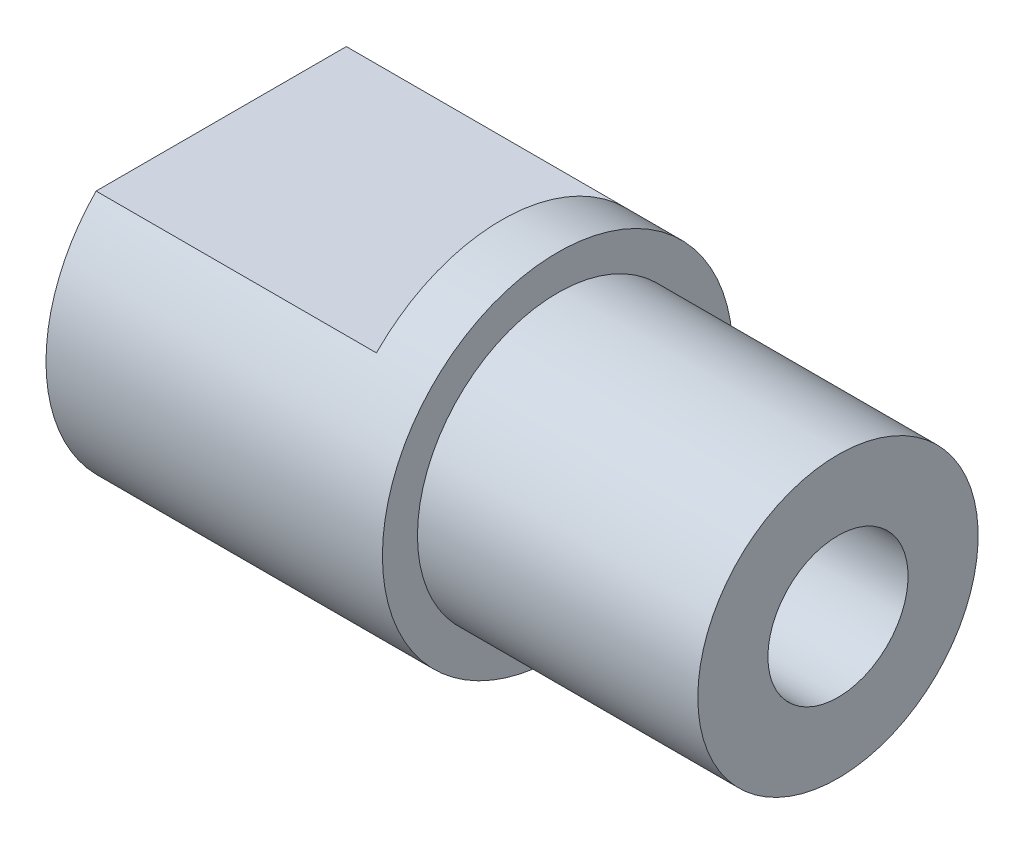
ISO-10303-21;
HEADER;
FILE_DESCRIPTION(('STEP AP214'),'2;1');
FILE_NAME('part.step','',(''),(''),'','','');
FILE_SCHEMA(('AUTOMOTIVE_DESIGN { 1 0 10303 214 1 1 1 1 }'));
ENDSEC;
DATA;
#1=APPLICATION_CONTEXT('core data for automotive mechanical design processes');
#2=APPLICATION_PROTOCOL_DEFINITION('international standard','automotive_design',2000,#1);
#3=PRODUCT_CONTEXT('',#1,'mechanical');
#4=PRODUCT('Part','Part','',(#3));
#5=PRODUCT_RELATED_PRODUCT_CATEGORY('part','',(#4));
#6=PRODUCT_DEFINITION_FORMATION('','',#4);
#7=PRODUCT_DEFINITION_CONTEXT('part definition',#1,'design');
#8=PRODUCT_DEFINITION('design','',#6,#7);
#9=PRODUCT_DEFINITION_SHAPE('','',#8);
#10=(LENGTH_UNIT() NAMED_UNIT(*) SI_UNIT(.MILLI.,.METRE.));
#11=(NAMED_UNIT(*) PLANE_ANGLE_UNIT() SI_UNIT($,.RADIAN.));
#12=(NAMED_UNIT(*) SI_UNIT($,.STERADIAN.) SOLID_ANGLE_UNIT());
#13=UNCERTAINTY_MEASURE_WITH_UNIT(LENGTH_MEASURE(1.E-05),#10,'distance_accuracy_value','');
#14=(GEOMETRIC_REPRESENTATION_CONTEXT(3) GLOBAL_UNCERTAINTY_ASSIGNED_CONTEXT((#13)) GLOBAL_UNIT_ASSIGNED_CONTEXT((#10,
#11,#12)) REPRESENTATION_CONTEXT('',''));
#15=CARTESIAN_POINT('',(0.,0.,0.));
#16=DIRECTION('',(0.,0.,1.));
#17=DIRECTION('',(1.,0.,0.));
#18=AXIS2_PLACEMENT_3D('',#15,#16,#17);
#19=CARTESIAN_POINT('',(0.,0.,0.));
#20=DIRECTION('',(-1.,0.,0.));
#21=DIRECTION('',(0.,0.,1.));
#22=AXIS2_PLACEMENT_3D('',#19,#20,#21);
#23=CYLINDRICAL_SURFACE('',#22,7.9375);
#24=CARTESIAN_POINT('',(12.7,0.,0.));
#25=DIRECTION('',(-1.,0.,0.));
#26=DIRECTION('',(0.,0.,1.));
#27=AXIS2_PLACEMENT_3D('',#24,#25,#26);
#28=CIRCLE('',#27,7.9375);
#29=CARTESIAN_POINT('',(12.7,5.55625,5.66850881515589));
#30=VERTEX_POINT('',#29);
#31=CARTESIAN_POINT('',(12.7,5.55625,-5.66850881515589));
#32=VERTEX_POINT('',#31);
#33=EDGE_CURVE('E88',#30,#32,#28,.T.);
#34=ORIENTED_EDGE('',*,*,#33,.F.);
#35=DIRECTION('',(-1.,0.,0.));
#36=VECTOR('',#35,1.);
#37=CARTESIAN_POINT('',(12.7,5.55625,5.66850881515589));
#38=LINE('',#37,#36);
#39=CARTESIAN_POINT('',(0.,5.55625,5.66850881515589));
#40=VERTEX_POINT('',#39);
#41=EDGE_CURVE('E97',#30,#40,#38,.T.);
#42=ORIENTED_EDGE('',*,*,#41,.T.);
#43=CARTESIAN_POINT('',(0.,0.,0.));
#44=DIRECTION('',(-1.,0.,0.));
#45=DIRECTION('',(0.,0.,1.));
#46=AXIS2_PLACEMENT_3D('',#43,#44,#45);
#47=CIRCLE('',#46,7.9375);
#48=CARTESIAN_POINT('',(0.,-5.55625,5.66850881515589));
#49=VERTEX_POINT('',#48);
#50=EDGE_CURVE('E108',#49,#40,#47,.T.);
#51=ORIENTED_EDGE('',*,*,#50,.F.);
#52=DIRECTION('',(-1.,0.,0.));
#53=VECTOR('',#52,1.);
#54=CARTESIAN_POINT('',(12.7,-5.55625,5.66850881515589));
#55=LINE('',#54,#53);
#56=CARTESIAN_POINT('',(12.7,-5.55625,5.66850881515589));
#57=VERTEX_POINT('',#56);
#58=EDGE_CURVE('E60',#57,#49,#55,.T.);
#59=ORIENTED_EDGE('',*,*,#58,.F.);
#60=CARTESIAN_POINT('',(12.7,0.,0.));
#61=DIRECTION('',(-1.,0.,0.));
#62=DIRECTION('',(0.,0.,1.));
#63=AXIS2_PLACEMENT_3D('',#60,#61,#62);
#64=CIRCLE('',#63,7.9375);
#65=CARTESIAN_POINT('',(12.7,-5.55625,-5.66850881515589));
#66=VERTEX_POINT('',#65);
#67=EDGE_CURVE('E121',#66,#57,#64,.T.);
#68=ORIENTED_EDGE('',*,*,#67,.F.);
#69=DIRECTION('',(-1.,0.,0.));
#70=VECTOR('',#69,1.);
#71=CARTESIAN_POINT('',(12.7,-5.55625,-5.66850881515589));
#72=LINE('',#71,#70);
#73=CARTESIAN_POINT('',(0.,-5.55625,-5.66850881515589));
#74=VERTEX_POINT('',#73);
#75=EDGE_CURVE('E115',#66,#74,#72,.T.);
#76=ORIENTED_EDGE('',*,*,#75,.T.);
#77=CARTESIAN_POINT('',(0.,5.55625,-5.66850881515589));
#78=VERTEX_POINT('',#77);
#79=EDGE_CURVE('E104',#78,#74,#47,.T.);
#80=ORIENTED_EDGE('',*,*,#79,.F.);
#81=DIRECTION('',(-1.,0.,0.));
#82=VECTOR('',#81,1.);
#83=CARTESIAN_POINT('',(12.7,5.55625,-5.66850881515589));
#84=LINE('',#83,#82);
#85=EDGE_CURVE('E68',#32,#78,#84,.T.);
#86=ORIENTED_EDGE('',*,*,#85,.F.);
#87=EDGE_LOOP('',(#34,#42,#51,#59,#68,#76,#80,#86));
#88=FACE_BOUND('',#87,.T.);
#89=CARTESIAN_POINT('',(15.24,0.,0.));
#90=DIRECTION('',(-1.,0.,0.));
#91=DIRECTION('',(0.,0.,1.));
#92=AXIS2_PLACEMENT_3D('',#89,#90,#91);
#93=CIRCLE('',#92,7.9375);
#94=CARTESIAN_POINT('',(15.24,0.,7.9375));
#95=VERTEX_POINT('',#94);
#96=EDGE_CURVE('E11',#95,#95,#93,.T.);
#97=ORIENTED_EDGE('',*,*,#96,.T.);
#98=EDGE_LOOP('',(#97));
#99=FACE_BOUND('',#98,.T.);
#100=ADVANCED_FACE('F45',(#88,#99),#23,.T.);
#101=CARTESIAN_POINT('',(15.24,7.9375,0.));
#102=DIRECTION('',(-1.,0.,0.));
#103=DIRECTION('',(0.,0.,1.));
#104=AXIS2_PLACEMENT_3D('',#101,#102,#103);
#105=PLANE('',#104);
#106=ORIENTED_EDGE('',*,*,#96,.F.);
#107=EDGE_LOOP('',(#106));
#108=FACE_BOUND('',#107,.T.);
#109=CARTESIAN_POINT('',(15.24,0.,0.));
#110=DIRECTION('',(-1.,0.,0.));
#111=DIRECTION('',(0.,0.,1.));
#112=AXIS2_PLACEMENT_3D('',#109,#110,#111);
#113=CIRCLE('',#112,6.35);
#114=CARTESIAN_POINT('',(15.24,0.,6.35));
#115=VERTEX_POINT('',#114);
#116=EDGE_CURVE('E53',#115,#115,#113,.T.);
#117=ORIENTED_EDGE('',*,*,#116,.T.);
#118=EDGE_LOOP('',(#117));
#119=FACE_BOUND('',#118,.T.);
#120=ADVANCED_FACE('F145',(#108,#119),#105,.F.);
#121=CARTESIAN_POINT('',(0.,0.,0.));
#122=DIRECTION('',(-1.,0.,0.));
#123=DIRECTION('',(0.,0.,1.));
#124=AXIS2_PLACEMENT_3D('',#121,#122,#123);
#125=CYLINDRICAL_SURFACE('',#124,6.35);
#126=ORIENTED_EDGE('',*,*,#116,.F.);
#127=EDGE_LOOP('',(#126));
#128=FACE_BOUND('',#127,.T.);
#129=CARTESIAN_POINT('',(27.94,0.,0.));
#130=DIRECTION('',(-1.,0.,0.));
#131=DIRECTION('',(0.,0.,1.));
#132=AXIS2_PLACEMENT_3D('',#129,#130,#131);
#133=CIRCLE('',#132,6.35);
#134=CARTESIAN_POINT('',(27.94,0.,6.35));
#135=VERTEX_POINT('',#134);
#136=EDGE_CURVE('E138',#135,#135,#133,.T.);
#137=ORIENTED_EDGE('',*,*,#136,.T.);
#138=EDGE_LOOP('',(#137));
#139=FACE_BOUND('',#138,.T.);
#140=ADVANCED_FACE('F147',(#128,#139),#125,.T.);
#141=CARTESIAN_POINT('',(27.94,6.35,0.));
#142=DIRECTION('',(-1.,0.,0.));
#143=DIRECTION('',(0.,0.,1.));
#144=AXIS2_PLACEMENT_3D('',#141,#142,#143);
#145=PLANE('',#144);
#146=ORIENTED_EDGE('',*,*,#136,.F.);
#147=EDGE_LOOP('',(#146));
#148=FACE_BOUND('',#147,.T.);
#149=CARTESIAN_POINT('',(27.94,0.,0.));
#150=DIRECTION('',(-1.,0.,0.));
#151=DIRECTION('',(0.,0.,1.));
#152=AXIS2_PLACEMENT_3D('',#149,#150,#151);
#153=CIRCLE('',#152,3.175);
#154=CARTESIAN_POINT('',(27.94,0.,3.175));
#155=VERTEX_POINT('',#154);
#156=EDGE_CURVE('E134',#155,#155,#153,.T.);
#157=ORIENTED_EDGE('',*,*,#156,.T.);
#158=EDGE_LOOP('',(#157));
#159=FACE_BOUND('',#158,.T.);
#160=ADVANCED_FACE('F150',(#148,#159),#145,.F.);
#161=CARTESIAN_POINT('',(0.,0.,0.));
#162=DIRECTION('',(-1.,0.,0.));
#163=DIRECTION('',(0.,0.,1.));
#164=AXIS2_PLACEMENT_3D('',#161,#162,#163);
#165=CYLINDRICAL_SURFACE('',#164,3.175);
#166=ORIENTED_EDGE('',*,*,#156,.F.);
#167=EDGE_LOOP('',(#166));
#168=FACE_BOUND('',#167,.T.);
#169=CARTESIAN_POINT('',(0.,0.,0.));
#170=DIRECTION('',(-1.,0.,0.));
#171=DIRECTION('',(0.,0.,1.));
#172=AXIS2_PLACEMENT_3D('',#169,#170,#171);
#173=CIRCLE('',#172,3.175);
#174=CARTESIAN_POINT('',(0.,0.,3.175));
#175=VERTEX_POINT('',#174);
#176=EDGE_CURVE('E130',#175,#175,#173,.T.);
#177=ORIENTED_EDGE('',*,*,#176,.T.);
#178=EDGE_LOOP('',(#177));
#179=FACE_BOUND('',#178,.T.);
#180=ADVANCED_FACE('F156',(#168,#179),#165,.F.);
#181=CARTESIAN_POINT('',(0.,3.175,0.));
#182=DIRECTION('',(1.,0.,0.));
#183=DIRECTION('',(0.,0.,-1.));
#184=AXIS2_PLACEMENT_3D('',#181,#182,#183);
#185=PLANE('',#184);
#186=ORIENTED_EDGE('',*,*,#176,.F.);
#187=EDGE_LOOP('',(#186));
#188=FACE_BOUND('',#187,.T.);
#189=ORIENTED_EDGE('',*,*,#50,.T.);
#190=DIRECTION('',(0.,0.,1.));
#191=VECTOR('',#190,1.);
#192=CARTESIAN_POINT('',(0.,5.55625,-5.66850881515589));
#193=LINE('',#192,#191);
#194=EDGE_CURVE('E94',#78,#40,#193,.T.);
#195=ORIENTED_EDGE('',*,*,#194,.F.);
#196=ORIENTED_EDGE('',*,*,#79,.T.);
#197=DIRECTION('',(0.,0.,-1.));
#198=VECTOR('',#197,1.);
#199=CARTESIAN_POINT('',(0.,-5.55625,-5.66850881515589));
#200=LINE('',#199,#198);
#201=EDGE_CURVE('E118',#49,#74,#200,.T.);
#202=ORIENTED_EDGE('',*,*,#201,.F.);
#203=EDGE_LOOP('',(#189,#195,#196,#202));
#204=FACE_BOUND('',#203,.T.);
#205=ADVANCED_FACE('F162',(#188,#204),#185,.F.);
#206=CARTESIAN_POINT('',(12.7,-5.55625,-5.66850881515589));
#207=DIRECTION('',(0.,1.,0.));
#208=DIRECTION('',(0.,0.,1.));
#209=AXIS2_PLACEMENT_3D('',#206,#207,#208);
#210=PLANE('',#209);
#211=ORIENTED_EDGE('',*,*,#201,.T.);
#212=ORIENTED_EDGE('',*,*,#75,.F.);
#213=DIRECTION('',(0.,0.,-1.));
#214=VECTOR('',#213,1.);
#215=CARTESIAN_POINT('',(12.7,-5.55625,-5.66850881515589));
#216=LINE('',#215,#214);
#217=EDGE_CURVE('E114',#57,#66,#216,.T.);
#218=ORIENTED_EDGE('',*,*,#217,.F.);
#219=ORIENTED_EDGE('',*,*,#58,.T.);
#220=EDGE_LOOP('',(#211,#212,#218,#219));
#221=FACE_BOUND('',#220,.T.);
#222=ADVANCED_FACE('F168',(#221),#210,.F.);
#223=CARTESIAN_POINT('',(12.7,0.,0.));
#224=DIRECTION('',(-1.,0.,0.));
#225=DIRECTION('',(0.,0.,1.));
#226=AXIS2_PLACEMENT_3D('',#223,#224,#225);
#227=PLANE('',#226);
#228=ORIENTED_EDGE('',*,*,#67,.T.);
#229=ORIENTED_EDGE('',*,*,#217,.T.);
#230=EDGE_LOOP('',(#228,#229));
#231=FACE_BOUND('',#230,.T.);
#232=ADVANCED_FACE('F173',(#231),#227,.T.);
#233=CARTESIAN_POINT('',(12.7,5.55625,-5.66850881515589));
#234=DIRECTION('',(0.,-1.,0.));
#235=DIRECTION('',(0.,0.,-1.));
#236=AXIS2_PLACEMENT_3D('',#233,#234,#235);
#237=PLANE('',#236);
#238=ORIENTED_EDGE('',*,*,#194,.T.);
#239=ORIENTED_EDGE('',*,*,#41,.F.);
#240=DIRECTION('',(0.,0.,1.));
#241=VECTOR('',#240,1.);
#242=CARTESIAN_POINT('',(12.7,5.55625,-5.66850881515589));
#243=LINE('',#242,#241);
#244=EDGE_CURVE('E90',#32,#30,#243,.T.);
#245=ORIENTED_EDGE('',*,*,#244,.F.);
#246=ORIENTED_EDGE('',*,*,#85,.T.);
#247=EDGE_LOOP('',(#238,#239,#245,#246));
#248=FACE_BOUND('',#247,.T.);
#249=ADVANCED_FACE('F96',(#248),#237,.F.);
#250=CARTESIAN_POINT('',(12.7,0.,0.));
#251=DIRECTION('',(-1.,0.,0.));
#252=DIRECTION('',(0.,0.,1.));
#253=AXIS2_PLACEMENT_3D('',#250,#251,#252);
#254=PLANE('',#253);
#255=ORIENTED_EDGE('',*,*,#33,.T.);
#256=ORIENTED_EDGE('',*,*,#244,.T.);
#257=EDGE_LOOP('',(#255,#256));
#258=FACE_BOUND('',#257,.T.);
#259=ADVANCED_FACE('F89',(#258),#254,.T.);
#260=CLOSED_SHELL('',(#100,#120,#140,#160,#180,#205,#222,#232,#249,#259));
#261=MANIFOLD_SOLID_BREP('B2',#260);
#262=ADVANCED_BREP_SHAPE_REPRESENTATION('',(#18,#261),#14);
#263=SHAPE_DEFINITION_REPRESENTATION(#9,#262);
ENDSEC;
END-ISO-10303-21;
